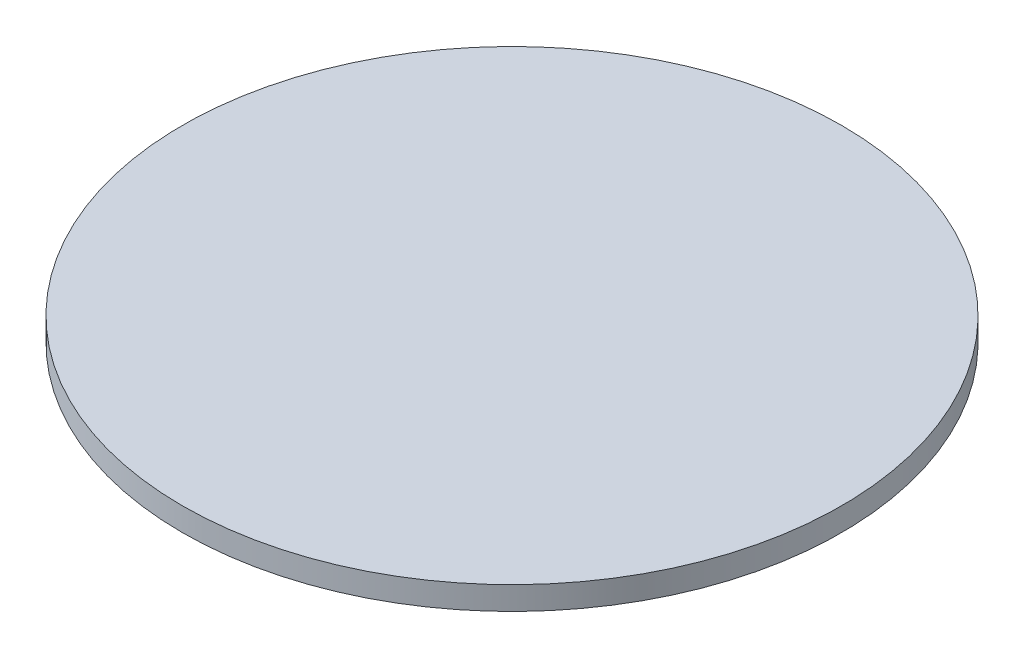
ISO-10303-21;
HEADER;
FILE_DESCRIPTION(('STEP AP214'),'2;1');
FILE_NAME('part.step','',(''),(''),'','','');
FILE_SCHEMA(('AUTOMOTIVE_DESIGN { 1 0 10303 214 1 1 1 1 }'));
ENDSEC;
DATA;
#1=APPLICATION_CONTEXT('core data for automotive mechanical design processes');
#2=APPLICATION_PROTOCOL_DEFINITION('international standard','automotive_design',2000,#1);
#3=PRODUCT_CONTEXT('',#1,'mechanical');
#4=PRODUCT('Part','Part','',(#3));
#5=PRODUCT_RELATED_PRODUCT_CATEGORY('part','',(#4));
#6=PRODUCT_DEFINITION_FORMATION('','',#4);
#7=PRODUCT_DEFINITION_CONTEXT('part definition',#1,'design');
#8=PRODUCT_DEFINITION('design','',#6,#7);
#9=PRODUCT_DEFINITION_SHAPE('','',#8);
#10=(LENGTH_UNIT() NAMED_UNIT(*) SI_UNIT(.MILLI.,.METRE.));
#11=(NAMED_UNIT(*) PLANE_ANGLE_UNIT() SI_UNIT($,.RADIAN.));
#12=(NAMED_UNIT(*) SI_UNIT($,.STERADIAN.) SOLID_ANGLE_UNIT());
#13=UNCERTAINTY_MEASURE_WITH_UNIT(LENGTH_MEASURE(1.E-05),#10,'distance_accuracy_value','');
#14=(GEOMETRIC_REPRESENTATION_CONTEXT(3) GLOBAL_UNCERTAINTY_ASSIGNED_CONTEXT((#13)) GLOBAL_UNIT_ASSIGNED_CONTEXT((#10,
#11,#12)) REPRESENTATION_CONTEXT('',''));
#15=CARTESIAN_POINT('',(0.,0.,0.));
#16=DIRECTION('',(0.,0.,1.));
#17=DIRECTION('',(1.,0.,0.));
#18=AXIS2_PLACEMENT_3D('',#15,#16,#17);
#19=CARTESIAN_POINT('',(0.,6.7,0.));
#20=DIRECTION('',(0.,-1.,0.));
#21=DIRECTION('',(0.,0.,-1.));
#22=AXIS2_PLACEMENT_3D('',#19,#20,#21);
#23=CYLINDRICAL_SURFACE('',#22,95.);
#24=CARTESIAN_POINT('',(0.,6.7,0.));
#25=DIRECTION('',(0.,1.,0.));
#26=DIRECTION('',(0.,0.,1.));
#27=AXIS2_PLACEMENT_3D('',#24,#25,#26);
#28=CIRCLE('',#27,95.);
#29=CARTESIAN_POINT('',(0.,6.7,95.));
#30=VERTEX_POINT('',#29);
#31=EDGE_CURVE('E10',#30,#30,#28,.T.);
#32=ORIENTED_EDGE('',*,*,#31,.F.);
#33=EDGE_LOOP('',(#32));
#34=FACE_BOUND('',#33,.T.);
#35=CARTESIAN_POINT('',(0.,0.,0.));
#36=DIRECTION('',(0.,1.,0.));
#37=DIRECTION('',(0.,0.,1.));
#38=AXIS2_PLACEMENT_3D('',#35,#36,#37);
#39=CIRCLE('',#38,95.);
#40=CARTESIAN_POINT('',(0.,0.,95.));
#41=VERTEX_POINT('',#40);
#42=EDGE_CURVE('E34',#41,#41,#39,.T.);
#43=ORIENTED_EDGE('',*,*,#42,.T.);
#44=EDGE_LOOP('',(#43));
#45=FACE_BOUND('',#44,.T.);
#46=ADVANCED_FACE('F31',(#34,#45),#23,.T.);
#47=CARTESIAN_POINT('',(0.,6.7,0.));
#48=DIRECTION('',(0.,1.,0.));
#49=DIRECTION('',(0.,0.,1.));
#50=AXIS2_PLACEMENT_3D('',#47,#48,#49);
#51=PLANE('',#50);
#52=ORIENTED_EDGE('',*,*,#31,.T.);
#53=EDGE_LOOP('',(#52));
#54=FACE_BOUND('',#53,.T.);
#55=ADVANCED_FACE('F46',(#54),#51,.T.);
#56=CARTESIAN_POINT('',(0.,0.,0.));
#57=DIRECTION('',(0.,1.,0.));
#58=DIRECTION('',(0.,0.,1.));
#59=AXIS2_PLACEMENT_3D('',#56,#57,#58);
#60=PLANE('',#59);
#61=ORIENTED_EDGE('',*,*,#42,.F.);
#62=EDGE_LOOP('',(#61));
#63=FACE_BOUND('',#62,.T.);
#64=ADVANCED_FACE('F44',(#63),#60,.F.);
#65=CLOSED_SHELL('',(#46,#55,#64));
#66=MANIFOLD_SOLID_BREP('B2',#65);
#67=ADVANCED_BREP_SHAPE_REPRESENTATION('',(#18,#66),#14);
#68=SHAPE_DEFINITION_REPRESENTATION(#9,#67);
ENDSEC;
END-ISO-10303-21;
